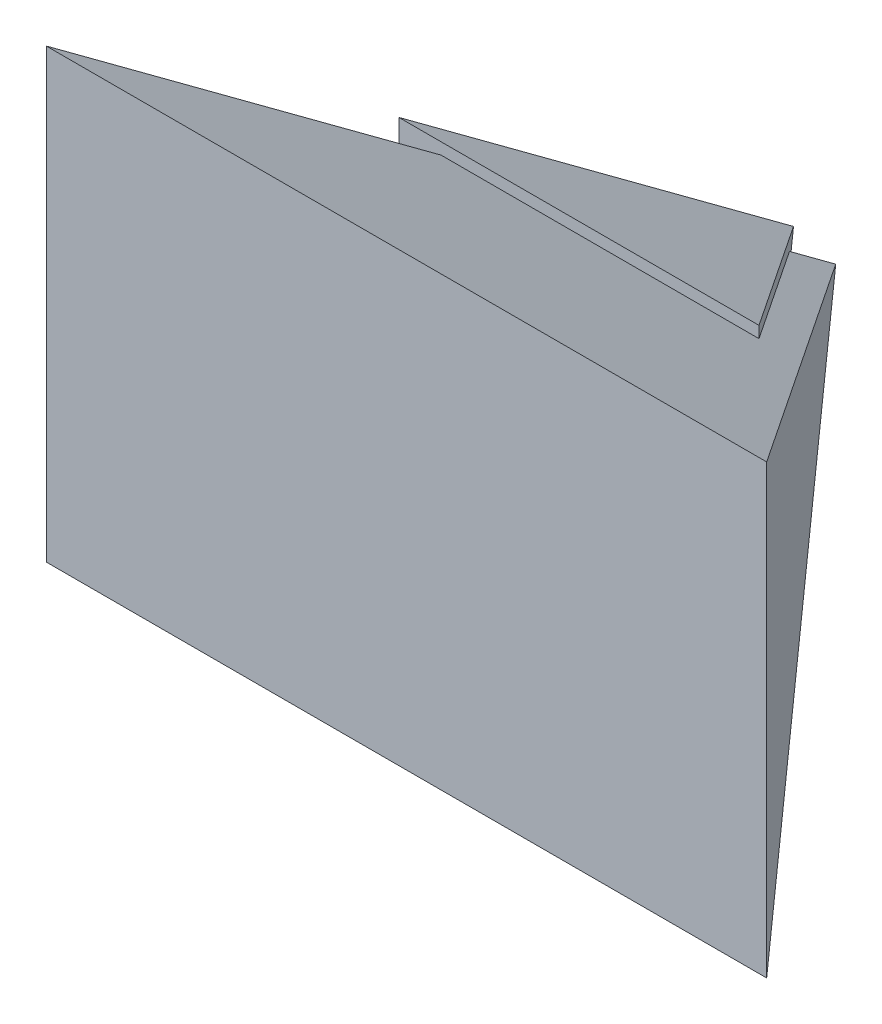
ISO-10303-21;
HEADER;
FILE_DESCRIPTION(('STEP AP214'),'2;1');
FILE_NAME('part.step','',(''),(''),'','','');
FILE_SCHEMA(('AUTOMOTIVE_DESIGN { 1 0 10303 214 1 1 1 1 }'));
ENDSEC;
DATA;
#1=APPLICATION_CONTEXT('core data for automotive mechanical design processes');
#2=APPLICATION_PROTOCOL_DEFINITION('international standard','automotive_design',2000,#1);
#3=PRODUCT_CONTEXT('',#1,'mechanical');
#4=PRODUCT('Part','Part','',(#3));
#5=PRODUCT_RELATED_PRODUCT_CATEGORY('part','',(#4));
#6=PRODUCT_DEFINITION_FORMATION('','',#4);
#7=PRODUCT_DEFINITION_CONTEXT('part definition',#1,'design');
#8=PRODUCT_DEFINITION('design','',#6,#7);
#9=PRODUCT_DEFINITION_SHAPE('','',#8);
#10=(LENGTH_UNIT() NAMED_UNIT(*) SI_UNIT(.MILLI.,.METRE.));
#11=(NAMED_UNIT(*) PLANE_ANGLE_UNIT() SI_UNIT($,.RADIAN.));
#12=(NAMED_UNIT(*) SI_UNIT($,.STERADIAN.) SOLID_ANGLE_UNIT());
#13=UNCERTAINTY_MEASURE_WITH_UNIT(LENGTH_MEASURE(1.E-05),#10,'distance_accuracy_value','');
#14=(GEOMETRIC_REPRESENTATION_CONTEXT(3) GLOBAL_UNCERTAINTY_ASSIGNED_CONTEXT((#13)) GLOBAL_UNIT_ASSIGNED_CONTEXT((#10,
#11,#12)) REPRESENTATION_CONTEXT('',''));
#15=CARTESIAN_POINT('',(0.,0.,0.));
#16=DIRECTION('',(0.,0.,1.));
#17=DIRECTION('',(1.,0.,0.));
#18=AXIS2_PLACEMENT_3D('',#15,#16,#17);
#19=CARTESIAN_POINT('',(22141.8297197681,-71.6798368003983,124.800473299424));
#20=DIRECTION('',(0.,0.,-1.));
#21=DIRECTION('',(0.,-1.,0.));
#22=AXIS2_PLACEMENT_3D('',#19,#20,#21);
#23=PLANE('',#22);
#24=DIRECTION('',(1.,0.,0.));
#25=VECTOR('',#24,1.);
#26=CARTESIAN_POINT('',(22141.8297197681,-71.6798368003983,124.800473299424));
#27=LINE('',#26,#25);
#28=CARTESIAN_POINT('',(-80.1702802318903,-71.6798368003983,124.800473299424));
#29=VERTEX_POINT('',#28);
#30=CARTESIAN_POINT('',(129.269782000704,-71.6798368003983,124.800473299424));
#31=VERTEX_POINT('',#30);
#32=EDGE_CURVE('P0_E49',#29,#31,#27,.T.);
#33=ORIENTED_EDGE('',*,*,#32,.T.);
#34=DIRECTION('',(0.,-1.,0.));
#35=VECTOR('',#34,1.);
#36=CARTESIAN_POINT('',(129.269782000704,-73.8410475820044,124.800473299424));
#37=LINE('',#36,#35);
#38=CARTESIAN_POINT('',(129.269782000704,58.2541917854884,124.800473299424));
#39=VERTEX_POINT('',#38);
#40=EDGE_CURVE('P0_E42',#39,#31,#37,.T.);
#41=ORIENTED_EDGE('',*,*,#40,.F.);
#42=DIRECTION('',(-1.,0.,0.));
#43=VECTOR('',#42,1.);
#44=CARTESIAN_POINT('',(22141.8297197681,58.2541917854884,124.800473299424));
#45=LINE('',#44,#43);
#46=CARTESIAN_POINT('',(-80.1702802318903,58.2541917854884,124.800473299424));
#47=VERTEX_POINT('',#46);
#48=EDGE_CURVE('P0_E11',#39,#47,#45,.T.);
#49=ORIENTED_EDGE('',*,*,#48,.T.);
#50=DIRECTION('',(0.,1.,0.));
#51=VECTOR('',#50,1.);
#52=CARTESIAN_POINT('',(-80.1702802318905,60.4154025670945,124.800473299424));
#53=LINE('',#52,#51);
#54=EDGE_CURVE('P0_E80',#29,#47,#53,.T.);
#55=ORIENTED_EDGE('',*,*,#54,.F.);
#56=EDGE_LOOP('',(#33,#41,#49,#55));
#57=FACE_BOUND('',#56,.T.);
#58=ADVANCED_FACE('P0_F38',(#57),#23,.F.);
#59=CARTESIAN_POINT('',(22141.8297197681,-6.71282250745495,0.));
#60=DIRECTION('',(0.,0.887010833178221,-0.461748613235035));
#61=DIRECTION('',(-1.,0.,0.));
#62=AXIS2_PLACEMENT_3D('',#59,#60,#61);
#63=PLANE('',#62);
#64=ORIENTED_EDGE('',*,*,#48,.F.);
#65=DIRECTION('',(0.597064675469345,0.370411552513298,0.711553972001685));
#66=VECTOR('',#65,1.);
#67=CARTESIAN_POINT('',(106.082698559257,43.869211516726,97.1671833062986));
#68=LINE('',#67,#66);
#69=CARTESIAN_POINT('',(24.5497508844096,-6.71282250745444,-9.4542429440736E-13));
#70=VERTEX_POINT('',#69);
#71=EDGE_CURVE('P0_E88',#70,#39,#68,.T.);
#72=ORIENTED_EDGE('',*,*,#71,.F.);
#73=DIRECTION('',(0.597064675469345,-0.370411552513298,-0.711553972001685));
#74=VECTOR('',#73,1.);
#75=CARTESIAN_POINT('',(-56.9831967904441,43.869211516726,97.1671833062986));
#76=LINE('',#75,#74);
#77=EDGE_CURVE('P0_E100',#47,#70,#76,.T.);
#78=ORIENTED_EDGE('',*,*,#77,.F.);
#79=EDGE_LOOP('',(#64,#72,#78));
#80=FACE_BOUND('',#79,.T.);
#81=ADVANCED_FACE('P0_F40',(#80),#63,.T.);
#82=CARTESIAN_POINT('',(22141.8297197681,-71.6798368003983,124.800473299424));
#83=DIRECTION('',(0.,-0.887010833178221,-0.461748613235036));
#84=DIRECTION('',(0.,0.461748613235036,-0.887010833178221));
#85=AXIS2_PLACEMENT_3D('',#82,#83,#84);
#86=PLANE('',#85);
#87=ORIENTED_EDGE('',*,*,#32,.F.);
#88=DIRECTION('',(-0.597064675469345,-0.370411552513298,0.711553972001685));
#89=VECTOR('',#88,1.);
#90=CARTESIAN_POINT('',(-115.754948166483,-93.7561254117804,167.208629151746));
#91=LINE('',#90,#89);
#92=EDGE_CURVE('P0_E73',#70,#29,#91,.T.);
#93=ORIENTED_EDGE('',*,*,#92,.F.);
#94=DIRECTION('',(-0.597064675469345,0.370411552513298,-0.711553972001685));
#95=VECTOR('',#94,1.);
#96=CARTESIAN_POINT('',(164.854449935296,-93.7561254117804,167.208629151746));
#97=LINE('',#96,#95);
#98=EDGE_CURVE('P0_E86',#31,#70,#97,.T.);
#99=ORIENTED_EDGE('',*,*,#98,.F.);
#100=EDGE_LOOP('',(#87,#93,#99));
#101=FACE_BOUND('',#100,.T.);
#102=ADVANCED_FACE('P0_F90',(#101),#86,.T.);
#103=CARTESIAN_POINT('',(-104.007771052902,-139.584597432906,153.208888623795));
#104=DIRECTION('',(-0.766044443118977,0.,-0.642787609686541));
#105=DIRECTION('',(-0.642787609686541,0.,0.766044443118977));
#106=AXIS2_PLACEMENT_3D('',#103,#104,#105);
#107=PLANE('',#106);
#108=ORIENTED_EDGE('',*,*,#54,.T.);
#109=ORIENTED_EDGE('',*,*,#77,.T.);
#110=ORIENTED_EDGE('',*,*,#92,.T.);
#111=EDGE_LOOP('',(#108,#109,#110));
#112=FACE_BOUND('',#111,.T.);
#113=ADVANCED_FACE('P0_F106',(#112),#107,.T.);
#114=CARTESIAN_POINT('',(153.107272821715,-139.584597432906,153.208888623795));
#115=DIRECTION('',(0.766044443118977,0.,-0.642787609686541));
#116=DIRECTION('',(0.,-1.,0.));
#117=AXIS2_PLACEMENT_3D('',#114,#115,#116);
#118=PLANE('',#117);
#119=ORIENTED_EDGE('',*,*,#98,.T.);
#120=ORIENTED_EDGE('',*,*,#71,.T.);
#121=ORIENTED_EDGE('',*,*,#40,.T.);
#122=EDGE_LOOP('',(#119,#120,#121));
#123=FACE_BOUND('',#122,.T.);
#124=ADVANCED_FACE('P0_F85',(#123),#118,.T.);
#125=CLOSED_SHELL('',(#58,#81,#102,#113,#124));
#126=MANIFOLD_SOLID_BREP('P0_B2',#125);
#127=CARTESIAN_POINT('',(11070.9148598841,-35.8399184001992,62.400236649712));
#128=DIRECTION('',(0.,0.,-1.));
#129=DIRECTION('',(0.,-1.,0.));
#130=AXIS2_PLACEMENT_3D('',#127,#128,#129);
#131=PLANE('',#130);
#132=DIRECTION('',(1.,0.,0.));
#133=VECTOR('',#132,1.);
#134=CARTESIAN_POINT('',(11070.9148598841,-35.8399184001992,62.400236649712));
#135=LINE('',#134,#133);
#136=CARTESIAN_POINT('',(-40.0851401159451,-35.8399184001992,62.400236649712));
#137=VERTEX_POINT('',#136);
#138=CARTESIAN_POINT('',(64.6348910003519,-35.8399184001992,62.400236649712));
#139=VERTEX_POINT('',#138);
#140=EDGE_CURVE('P1_E27',#137,#139,#135,.T.);
#141=ORIENTED_EDGE('',*,*,#140,.T.);
#142=DIRECTION('',(0.,-1.,0.));
#143=VECTOR('',#142,1.);
#144=CARTESIAN_POINT('',(64.6348910003519,-36.9205237910022,62.400236649712));
#145=LINE('',#144,#143);
#146=CARTESIAN_POINT('',(64.6348910003519,29.1270958927442,62.400236649712));
#147=VERTEX_POINT('',#146);
#148=EDGE_CURVE('P1_E20',#147,#139,#145,.T.);
#149=ORIENTED_EDGE('',*,*,#148,.F.);
#150=DIRECTION('',(-1.,0.,0.));
#151=VECTOR('',#150,1.);
#152=CARTESIAN_POINT('',(11070.9148598841,29.1270958927442,62.400236649712));
#153=LINE('',#152,#151);
#154=CARTESIAN_POINT('',(-40.0851401159451,29.1270958927442,62.400236649712));
#155=VERTEX_POINT('',#154);
#156=EDGE_CURVE('P1_E11',#147,#155,#153,.T.);
#157=ORIENTED_EDGE('',*,*,#156,.T.);
#158=DIRECTION('',(0.,1.,0.));
#159=VECTOR('',#158,1.);
#160=CARTESIAN_POINT('',(-40.0851401159453,30.2077012835472,62.400236649712));
#161=LINE('',#160,#159);
#162=EDGE_CURVE('P1_E63',#137,#155,#161,.T.);
#163=ORIENTED_EDGE('',*,*,#162,.F.);
#164=EDGE_LOOP('',(#141,#149,#157,#163));
#165=FACE_BOUND('',#164,.T.);
#166=ADVANCED_FACE('P1_F16',(#165),#131,.F.);
#167=CARTESIAN_POINT('',(11070.9148598841,-3.35641125372748,0.));
#168=DIRECTION('',(0.,0.887010833178221,-0.461748613235035));
#169=DIRECTION('',(-1.,0.,0.));
#170=AXIS2_PLACEMENT_3D('',#167,#168,#169);
#171=PLANE('',#170);
#172=ORIENTED_EDGE('',*,*,#156,.F.);
#173=DIRECTION('',(0.597064675469345,0.370411552513298,0.711553972001685));
#174=VECTOR('',#173,1.);
#175=CARTESIAN_POINT('',(53.0413492796287,21.934605758363,48.5835916531493));
#176=LINE('',#175,#174);
#177=CARTESIAN_POINT('',(12.2748754422048,-3.35641125372722,-4.7271214720368E-13));
#178=VERTEX_POINT('',#177);
#179=EDGE_CURVE('P1_E71',#178,#147,#176,.T.);
#180=ORIENTED_EDGE('',*,*,#179,.F.);
#181=DIRECTION('',(0.597064675469345,-0.370411552513298,-0.711553972001685));
#182=VECTOR('',#181,1.);
#183=CARTESIAN_POINT('',(-28.491598395222,21.934605758363,48.5835916531493));
#184=LINE('',#183,#182);
#185=EDGE_CURVE('P1_E84',#155,#178,#184,.T.);
#186=ORIENTED_EDGE('',*,*,#185,.F.);
#187=EDGE_LOOP('',(#172,#180,#186));
#188=FACE_BOUND('',#187,.T.);
#189=ADVANCED_FACE('P1_F18',(#188),#171,.T.);
#190=CARTESIAN_POINT('',(11070.9148598841,-35.8399184001992,62.400236649712));
#191=DIRECTION('',(0.,-0.887010833178221,-0.461748613235036));
#192=DIRECTION('',(0.,0.461748613235036,-0.887010833178221));
#193=AXIS2_PLACEMENT_3D('',#190,#191,#192);
#194=PLANE('',#193);
#195=ORIENTED_EDGE('',*,*,#140,.F.);
#196=DIRECTION('',(-0.597064675469345,-0.370411552513298,0.711553972001685));
#197=VECTOR('',#196,1.);
#198=CARTESIAN_POINT('',(-57.8774740832413,-46.8780627058902,83.6043145758729));
#199=LINE('',#198,#197);
#200=EDGE_CURVE('P1_E54',#178,#137,#199,.T.);
#201=ORIENTED_EDGE('',*,*,#200,.F.);
#202=DIRECTION('',(-0.597064675469345,0.370411552513298,-0.711553972001685));
#203=VECTOR('',#202,1.);
#204=CARTESIAN_POINT('',(82.4272249676479,-46.8780627058902,83.6043145758729));
#205=LINE('',#204,#203);
#206=EDGE_CURVE('P1_E69',#139,#178,#205,.T.);
#207=ORIENTED_EDGE('',*,*,#206,.F.);
#208=EDGE_LOOP('',(#195,#201,#207));
#209=FACE_BOUND('',#208,.T.);
#210=ADVANCED_FACE('P1_F73',(#209),#194,.T.);
#211=CARTESIAN_POINT('',(-52.0038855264508,-69.7922987164528,76.6044443118977));
#212=DIRECTION('',(-0.766044443118977,0.,-0.642787609686541));
#213=DIRECTION('',(-0.642787609686541,0.,0.766044443118977));
#214=AXIS2_PLACEMENT_3D('',#211,#212,#213);
#215=PLANE('',#214);
#216=ORIENTED_EDGE('',*,*,#162,.T.);
#217=ORIENTED_EDGE('',*,*,#185,.T.);
#218=ORIENTED_EDGE('',*,*,#200,.T.);
#219=EDGE_LOOP('',(#216,#217,#218));
#220=FACE_BOUND('',#219,.T.);
#221=ADVANCED_FACE('P1_F92',(#220),#215,.T.);
#222=CARTESIAN_POINT('',(76.5536364108574,-69.7922987164528,76.6044443118977));
#223=DIRECTION('',(0.766044443118977,0.,-0.642787609686541));
#224=DIRECTION('',(0.,-1.,0.));
#225=AXIS2_PLACEMENT_3D('',#222,#223,#224);
#226=PLANE('',#225);
#227=ORIENTED_EDGE('',*,*,#206,.T.);
#228=ORIENTED_EDGE('',*,*,#179,.T.);
#229=ORIENTED_EDGE('',*,*,#148,.T.);
#230=EDGE_LOOP('',(#227,#228,#229));
#231=FACE_BOUND('',#230,.T.);
#232=ADVANCED_FACE('P1_F68',(#231),#226,.T.);
#233=CLOSED_SHELL('',(#166,#189,#210,#221,#232));
#234=MANIFOLD_SOLID_BREP('P1_B1',#233);
#235=ADVANCED_BREP_SHAPE_REPRESENTATION('',(#18,#126,#234),#14);
#236=SHAPE_DEFINITION_REPRESENTATION(#9,#235);
ENDSEC;
END-ISO-10303-21;
